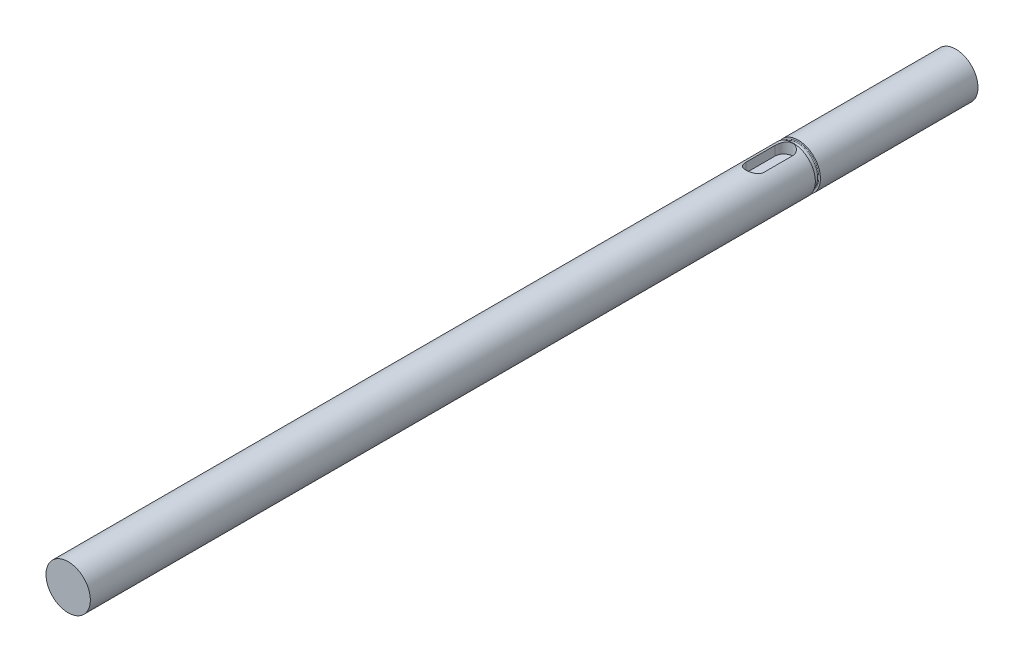
ISO-10303-21;
HEADER;
FILE_DESCRIPTION(('STEP AP214'),'2;1');
FILE_NAME('part.step','',(''),(''),'','','');
FILE_SCHEMA(('AUTOMOTIVE_DESIGN { 1 0 10303 214 1 1 1 1 }'));
ENDSEC;
DATA;
#1=APPLICATION_CONTEXT('core data for automotive mechanical design processes');
#2=APPLICATION_PROTOCOL_DEFINITION('international standard','automotive_design',2000,#1);
#3=PRODUCT_CONTEXT('',#1,'mechanical');
#4=PRODUCT('Part','Part','',(#3));
#5=PRODUCT_RELATED_PRODUCT_CATEGORY('part','',(#4));
#6=PRODUCT_DEFINITION_FORMATION('','',#4);
#7=PRODUCT_DEFINITION_CONTEXT('part definition',#1,'design');
#8=PRODUCT_DEFINITION('design','',#6,#7);
#9=PRODUCT_DEFINITION_SHAPE('','',#8);
#10=(LENGTH_UNIT() NAMED_UNIT(*) SI_UNIT(.MILLI.,.METRE.));
#11=(NAMED_UNIT(*) PLANE_ANGLE_UNIT() SI_UNIT($,.RADIAN.));
#12=(NAMED_UNIT(*) SI_UNIT($,.STERADIAN.) SOLID_ANGLE_UNIT());
#13=UNCERTAINTY_MEASURE_WITH_UNIT(LENGTH_MEASURE(1.E-05),#10,'distance_accuracy_value','');
#14=(GEOMETRIC_REPRESENTATION_CONTEXT(3) GLOBAL_UNCERTAINTY_ASSIGNED_CONTEXT((#13)) GLOBAL_UNIT_ASSIGNED_CONTEXT((#10,
#11,#12)) REPRESENTATION_CONTEXT('',''));
#15=CARTESIAN_POINT('',(0.,0.,0.));
#16=DIRECTION('',(0.,0.,1.));
#17=DIRECTION('',(1.,0.,0.));
#18=AXIS2_PLACEMENT_3D('',#15,#16,#17);
#19=CARTESIAN_POINT('',(0.,0.,-100.));
#20=DIRECTION('',(0.,0.,1.));
#21=DIRECTION('',(-1.,0.,0.));
#22=AXIS2_PLACEMENT_3D('',#19,#20,#21);
#23=CYLINDRICAL_SURFACE('',#22,5.);
#24=CARTESIAN_POINT('',(-1.99999999999998,4.58257569495585,-61.25));
#25=CARTESIAN_POINT('',(-2.00000798036346,4.58256464470382,-61.3038058525026));
#26=CARTESIAN_POINT('',(-1.99782891366023,4.58352306077323,-61.3576056655577));
#27=CARTESIAN_POINT('',(-1.98915905973445,4.58729625417544,-61.4647712982547));
#28=CARTESIAN_POINT('',(-1.98266991468791,4.59011032448546,-61.518137275356));
#29=CARTESIAN_POINT('',(-1.96547603676368,4.5974978292064,-61.6238468215588));
#30=CARTESIAN_POINT('',(-1.95478796820432,4.60206430717534,-61.676193584044));
#31=CARTESIAN_POINT('',(-1.92931630190659,4.61280053296683,-61.7797007717145));
#32=CARTESIAN_POINT('',(-1.91453245417089,4.61897037865399,-61.8308611242772));
#33=CARTESIAN_POINT('',(-1.86426971793521,4.63959291248422,-61.981935850582));
#34=CARTESIAN_POINT('',(-1.82284489460006,4.65617449157431,-62.0796542306897));
#35=CARTESIAN_POINT('',(-1.72548191592175,4.69312370765381,-62.2667955800826));
#36=CARTESIAN_POINT('',(-1.66952996336924,4.71349493864008,-62.3562105529617));
#37=CARTESIAN_POINT('',(-1.54131835736853,4.75700999402115,-62.5292623966742));
#38=CARTESIAN_POINT('',(-1.46836913992728,4.78024245635517,-62.6123672169202));
#39=CARTESIAN_POINT('',(-1.30969646176207,4.82612790548656,-62.7655402722107));
#40=CARTESIAN_POINT('',(-1.2239703849968,4.84878077249721,-62.8356058308657));
#41=CARTESIAN_POINT('',(-1.03800590808967,4.89203417106082,-62.9634063941957));
#42=CARTESIAN_POINT('',(-0.937327933050951,4.91251824543531,-63.0205448092619));
#43=CARTESIAN_POINT('',(-0.7268241432467,4.94803944125004,-63.1168440726887));
#44=CARTESIAN_POINT('',(-0.617002169026234,4.96307883544185,-63.1560124240517));
#45=CARTESIAN_POINT('',(-0.39696744129568,4.98538314653816,-63.2133412013106));
#46=CARTESIAN_POINT('',(-0.287031054523049,4.99298922547927,-63.2324269509057));
#47=CARTESIAN_POINT('',(-0.0652684304565053,5.00080310201085,-63.2520284799456));
#48=CARTESIAN_POINT('',(0.0465571232841751,5.0010135205303,-63.2525508380235));
#49=CARTESIAN_POINT('',(0.262233376226791,4.99421960045302,-63.2355171608401));
#50=CARTESIAN_POINT('',(0.366179202506797,4.98761985585461,-63.218974953326));
#51=CARTESIAN_POINT('',(0.569674786500935,4.96849270441446,-63.1700065729465));
#52=CARTESIAN_POINT('',(0.669224295072849,4.95596496209929,-63.1375795011314));
#53=CARTESIAN_POINT('',(0.862897539070301,4.92596830598785,-63.0573637035755));
#54=CARTESIAN_POINT('',(0.956916851366443,4.90842774755848,-63.0093507591896));
#55=CARTESIAN_POINT('',(1.13580746919776,4.87014602008043,-62.8995354114048));
#56=CARTESIAN_POINT('',(1.22067554984698,4.84940372896448,-62.8377281703094));
#57=CARTESIAN_POINT('',(1.38476339273627,4.80521782746143,-62.6973558197415));
#58=CARTESIAN_POINT('',(1.4632477030894,4.78168627172884,-62.61795752533));
#59=CARTESIAN_POINT('',(1.60609926099478,4.7356195058465,-62.4470199048523));
#60=CARTESIAN_POINT('',(1.67046007709005,4.71308475332783,-62.3554750779057));
#61=CARTESIAN_POINT('',(1.78493657933605,4.67095688856025,-62.1595297159788));
#62=CARTESIAN_POINT('',(1.83458932217622,4.65146702150583,-62.0548351633398));
#63=CARTESIAN_POINT('',(1.91521298357264,4.61886105059582,-61.8376384755705));
#64=CARTESIAN_POINT('',(1.94621696002208,4.60573367628738,-61.7251505526617));
#65=CARTESIAN_POINT('',(1.9781058182572,4.59208303529493,-61.551256365842));
#66=CARTESIAN_POINT('',(1.98630505165979,4.58853437680526,-61.4913424506987));
#67=CARTESIAN_POINT('',(1.99725282103812,4.58377540314389,-61.3709649810045));
#68=CARTESIAN_POINT('',(2.00000471568568,4.58256364711745,-61.3105017882422));
#69=CARTESIAN_POINT('',(2.,4.58257569495584,-61.25));
#70=B_SPLINE_CURVE_WITH_KNOTS('',3,(#24,#25,#26,#27,#28,#29,#30,#31,#32,#33,#34,#35,#36,#37,#38,
#39,#40,#41,#42,#43,#44,#45,#46,#47,#48,#49,#50,#51,#52,#53,#54,#55,#56,#57,#58,#59,#60,#61,#62,
#63,#64,#65,#66,#67,#68,#69),.UNSPECIFIED.,.F.,.F.,(4,2,2,2,2,2,2,2,2,2,2,2,2,2,2,2,2,2,2,2,2,2,
4),(0.,0.161354853098824,0.322648263883208,0.483307911251883,0.643977367092303,
0.964683001739086,1.28569434942625,1.62318047995497,1.96073580539189,2.31162858925762,
2.66237473197321,2.99613876504268,3.32978451514654,3.64468915259533,3.95961161305652,
4.27928176927544,4.59906421133017,4.9398187467515,5.28072813203931,5.63144241548458,
5.98153315592122,6.1630019255781,6.34435877193558),.UNSPECIFIED.);
#71=CARTESIAN_POINT('',(-1.99999999999998,4.58257569495585,-61.25));
#72=VERTEX_POINT('',#71);
#73=CARTESIAN_POINT('',(2.,4.58257569495584,-61.25));
#74=VERTEX_POINT('',#73);
#75=EDGE_CURVE('E116',#72,#74,#70,.T.);
#76=ORIENTED_EDGE('',*,*,#75,.T.);
#77=DIRECTION('',(0.,0.,1.));
#78=VECTOR('',#77,1.);
#79=CARTESIAN_POINT('',(1.99999999999998,4.58257569495585,-100.));
#80=LINE('',#79,#78);
#81=CARTESIAN_POINT('',(1.99999999999999,4.58257569495585,-54.75));
#82=VERTEX_POINT('',#81);
#83=EDGE_CURVE('E47',#74,#82,#80,.T.);
#84=ORIENTED_EDGE('',*,*,#83,.T.);
#85=CARTESIAN_POINT('',(2.,4.58257569495584,-54.75));
#86=CARTESIAN_POINT('',(2.00000798036348,4.58256464470381,-54.6961941474974));
#87=CARTESIAN_POINT('',(1.99782891366025,4.58352306077323,-54.6423943344424));
#88=CARTESIAN_POINT('',(1.98915905973447,4.58729625417543,-54.5352287017453));
#89=CARTESIAN_POINT('',(1.98266991468793,4.59011032448545,-54.481862724644));
#90=CARTESIAN_POINT('',(1.9654760367637,4.59749782920639,-54.3761531784412));
#91=CARTESIAN_POINT('',(1.95478796820434,4.60206430717533,-54.323806415956));
#92=CARTESIAN_POINT('',(1.92931630190661,4.61280053296682,-54.2202992282855));
#93=CARTESIAN_POINT('',(1.91453245417091,4.61897037865398,-54.1691388757228));
#94=CARTESIAN_POINT('',(1.86426971793523,4.63959291248421,-54.018064149418));
#95=CARTESIAN_POINT('',(1.82284489460008,4.6561744915743,-53.9203457693103));
#96=CARTESIAN_POINT('',(1.72548191592177,4.6931237076538,-53.7332044199174));
#97=CARTESIAN_POINT('',(1.66952996336926,4.71349493864007,-53.6437894470384));
#98=CARTESIAN_POINT('',(1.54131835736855,4.75700999402114,-53.4707376033258));
#99=CARTESIAN_POINT('',(1.46836913992731,4.78024245635516,-53.3876327830798));
#100=CARTESIAN_POINT('',(1.30969646176209,4.82612790548656,-53.2344597277893));
#101=CARTESIAN_POINT('',(1.22397038499682,4.84878077249721,-53.1643941691343));
#102=CARTESIAN_POINT('',(1.03800590808969,4.89203417106082,-53.0365936058044));
#103=CARTESIAN_POINT('',(0.937327933050968,4.91251824543531,-52.9794551907381));
#104=CARTESIAN_POINT('',(0.726824143246719,4.94803944125003,-52.8831559273114));
#105=CARTESIAN_POINT('',(0.617002169026255,4.96307883544185,-52.8439875759483));
#106=CARTESIAN_POINT('',(0.396967441295703,4.98538314653816,-52.7866587986894));
#107=CARTESIAN_POINT('',(0.287031054523071,4.99298922547927,-52.7675730490944));
#108=CARTESIAN_POINT('',(0.0652684304565268,5.00080310201086,-52.7479715200544));
#109=CARTESIAN_POINT('',(-0.046557123284154,5.0010135205303,-52.7474491619765));
#110=CARTESIAN_POINT('',(-0.262233376226772,4.99421960045302,-52.7644828391599));
#111=CARTESIAN_POINT('',(-0.366179202506779,4.98761985585461,-52.781025046674));
#112=CARTESIAN_POINT('',(-0.569674786500916,4.96849270441446,-52.8299934270536));
#113=CARTESIAN_POINT('',(-0.669224295072828,4.95596496209929,-52.8624204988686));
#114=CARTESIAN_POINT('',(-0.86289753907028,4.92596830598785,-52.9426362964245));
#115=CARTESIAN_POINT('',(-0.956916851366425,4.90842774755848,-52.9906492408105));
#116=CARTESIAN_POINT('',(-1.13580746919775,4.87014602008043,-53.1004645885952));
#117=CARTESIAN_POINT('',(-1.22067554984696,4.84940372896449,-53.1622718296906));
#118=CARTESIAN_POINT('',(-1.38476339273625,4.80521782746144,-53.3026441802585));
#119=CARTESIAN_POINT('',(-1.46324770308938,4.78168627172885,-53.38204247467));
#120=CARTESIAN_POINT('',(-1.60609926099476,4.73561950584651,-53.5529800951477));
#121=CARTESIAN_POINT('',(-1.67046007709003,4.71308475332784,-53.6445249220943));
#122=CARTESIAN_POINT('',(-1.78493657933603,4.67095688856025,-53.8404702840212));
#123=CARTESIAN_POINT('',(-1.8345893221762,4.65146702150584,-53.9451648366602));
#124=CARTESIAN_POINT('',(-1.91521298357262,4.61886105059582,-54.1623615244295));
#125=CARTESIAN_POINT('',(-1.94621696002206,4.60573367628739,-54.2748494473383));
#126=CARTESIAN_POINT('',(-1.97810581825718,4.59208303529494,-54.448743634158));
#127=CARTESIAN_POINT('',(-1.98630505165977,4.58853437680527,-54.5086575493013));
#128=CARTESIAN_POINT('',(-1.99725282103809,4.5837754031439,-54.6290350189955));
#129=CARTESIAN_POINT('',(-2.00000471568566,4.58256364711745,-54.6894982117578));
#130=CARTESIAN_POINT('',(-1.99999999999998,4.58257569495585,-54.75));
#131=B_SPLINE_CURVE_WITH_KNOTS('',3,(#85,#86,#87,#88,#89,#90,#91,#92,#93,#94,#95,#96,#97,#98,
#99,#100,#101,#102,#103,#104,#105,#106,#107,#108,#109,#110,#111,#112,#113,#114,#115,#116,#117,
#118,#119,#120,#121,#122,#123,#124,#125,#126,#127,#128,#129,#130),.UNSPECIFIED.,.F.,.F.,(4,2,2,
2,2,2,2,2,2,2,2,2,2,2,2,2,2,2,2,2,2,2,4),(0.,0.161354853098824,0.322648263883208,
0.483307911251883,0.643977367092303,0.964683001739087,1.28569434942625,1.62318047995497,
1.9607358053919,2.31162858925762,2.66237473197321,2.99613876504268,3.32978451514654,
3.64468915259533,3.95961161305652,4.27928176927545,4.59906421133017,4.9398187467515,
5.2807281320393,5.63144241548458,5.98153315592122,6.1630019255781,6.34435877193558),.UNSPECIFIED.);
#132=CARTESIAN_POINT('',(-1.99999999999999,4.58257569495584,-54.75));
#133=VERTEX_POINT('',#132);
#134=EDGE_CURVE('E125',#82,#133,#131,.T.);
#135=ORIENTED_EDGE('',*,*,#134,.T.);
#136=DIRECTION('',(0.,0.,1.));
#137=VECTOR('',#136,1.);
#138=CARTESIAN_POINT('',(-2.,4.58257569495584,-100.));
#139=LINE('',#138,#137);
#140=EDGE_CURVE('E11',#133,#72,#139,.F.);
#141=ORIENTED_EDGE('',*,*,#140,.T.);
#142=EDGE_LOOP('',(#76,#84,#135,#141));
#143=FACE_BOUND('',#142,.T.);
#144=CARTESIAN_POINT('',(0.,0.,100.));
#145=DIRECTION('',(0.,0.,1.));
#146=DIRECTION('',(1.,0.,0.));
#147=AXIS2_PLACEMENT_3D('',#144,#145,#146);
#148=CIRCLE('',#147,5.);
#149=CARTESIAN_POINT('',(5.,0.,100.));
#150=VERTEX_POINT('',#149);
#151=EDGE_CURVE('E95',#150,#150,#148,.T.);
#152=ORIENTED_EDGE('',*,*,#151,.F.);
#153=EDGE_LOOP('',(#152));
#154=FACE_BOUND('',#153,.T.);
#155=CARTESIAN_POINT('',(0.,0.,-63.35));
#156=DIRECTION('',(0.,0.,1.));
#157=DIRECTION('',(0.,-1.,0.));
#158=AXIS2_PLACEMENT_3D('',#155,#156,#157);
#159=CIRCLE('',#158,5.);
#160=CARTESIAN_POINT('',(0.,-5.,-63.35));
#161=VERTEX_POINT('',#160);
#162=EDGE_CURVE('E102',#161,#161,#159,.T.);
#163=ORIENTED_EDGE('',*,*,#162,.T.);
#164=EDGE_LOOP('',(#163));
#165=FACE_BOUND('',#164,.T.);
#166=ADVANCED_FACE('F37',(#143,#154,#165),#23,.T.);
#167=CARTESIAN_POINT('',(0.,0.,100.));
#168=DIRECTION('',(0.,0.,-1.));
#169=DIRECTION('',(1.,0.,0.));
#170=AXIS2_PLACEMENT_3D('',#167,#168,#169);
#171=PLANE('',#170);
#172=ORIENTED_EDGE('',*,*,#151,.T.);
#173=EDGE_LOOP('',(#172));
#174=FACE_BOUND('',#173,.T.);
#175=ADVANCED_FACE('F142',(#174),#171,.F.);
#176=CARTESIAN_POINT('',(0.,5.,-54.75));
#177=DIRECTION('',(0.,-1.,0.));
#178=DIRECTION('',(0.,0.,1.));
#179=AXIS2_PLACEMENT_3D('',#176,#177,#178);
#180=CYLINDRICAL_SURFACE('',#179,1.99999999999999);
#181=DIRECTION('',(0.,-1.,0.));
#182=VECTOR('',#181,1.);
#183=CARTESIAN_POINT('',(1.99999999999999,5.,-54.75));
#184=LINE('',#183,#182);
#185=CARTESIAN_POINT('',(1.99999999999999,2.5,-54.75));
#186=VERTEX_POINT('',#185);
#187=EDGE_CURVE('E99',#82,#186,#184,.T.);
#188=ORIENTED_EDGE('',*,*,#187,.T.);
#189=CARTESIAN_POINT('',(0.,2.5,-54.75));
#190=DIRECTION('',(0.,-1.,0.));
#191=DIRECTION('',(0.,0.,-1.));
#192=AXIS2_PLACEMENT_3D('',#189,#190,#191);
#193=CIRCLE('',#192,1.99999999999999);
#194=CARTESIAN_POINT('',(-1.99999999999999,2.5,-54.75));
#195=VERTEX_POINT('',#194);
#196=EDGE_CURVE('E87',#186,#195,#193,.T.);
#197=ORIENTED_EDGE('',*,*,#196,.T.);
#198=DIRECTION('',(0.,-1.,0.));
#199=VECTOR('',#198,1.);
#200=CARTESIAN_POINT('',(-1.99999999999999,5.,-54.75));
#201=LINE('',#200,#199);
#202=EDGE_CURVE('E63',#133,#195,#201,.T.);
#203=ORIENTED_EDGE('',*,*,#202,.F.);
#204=ORIENTED_EDGE('',*,*,#134,.F.);
#205=EDGE_LOOP('',(#188,#197,#203,#204));
#206=FACE_BOUND('',#205,.T.);
#207=ADVANCED_FACE('F98',(#206),#180,.F.);
#208=CARTESIAN_POINT('',(-1.99999999999999,5.,-54.75));
#209=DIRECTION('',(1.,0.,0.));
#210=DIRECTION('',(0.,0.,1.));
#211=AXIS2_PLACEMENT_3D('',#208,#209,#210);
#212=PLANE('',#211);
#213=ORIENTED_EDGE('',*,*,#140,.F.);
#214=ORIENTED_EDGE('',*,*,#202,.T.);
#215=DIRECTION('',(0.,0.,-1.));
#216=VECTOR('',#215,1.);
#217=CARTESIAN_POINT('',(-1.99999999999999,2.5,-54.75));
#218=LINE('',#217,#216);
#219=CARTESIAN_POINT('',(-1.99999999999998,2.5,-61.25));
#220=VERTEX_POINT('',#219);
#221=EDGE_CURVE('E85',#195,#220,#218,.T.);
#222=ORIENTED_EDGE('',*,*,#221,.T.);
#223=DIRECTION('',(0.,-1.,0.));
#224=VECTOR('',#223,1.);
#225=CARTESIAN_POINT('',(-1.99999999999998,5.,-61.25));
#226=LINE('',#225,#224);
#227=EDGE_CURVE('E96',#72,#220,#226,.T.);
#228=ORIENTED_EDGE('',*,*,#227,.F.);
#229=EDGE_LOOP('',(#213,#214,#222,#228));
#230=FACE_BOUND('',#229,.T.);
#231=ADVANCED_FACE('F93',(#230),#212,.T.);
#232=CARTESIAN_POINT('',(0.,5.,-61.25));
#233=DIRECTION('',(0.,-1.,0.));
#234=DIRECTION('',(0.,0.,1.));
#235=AXIS2_PLACEMENT_3D('',#232,#233,#234);
#236=CYLINDRICAL_SURFACE('',#235,1.99999999999999);
#237=ORIENTED_EDGE('',*,*,#227,.T.);
#238=CARTESIAN_POINT('',(0.,2.5,-61.25));
#239=DIRECTION('',(0.,-1.,0.));
#240=DIRECTION('',(0.,0.,-1.));
#241=AXIS2_PLACEMENT_3D('',#238,#239,#240);
#242=CIRCLE('',#241,1.99999999999999);
#243=CARTESIAN_POINT('',(1.99999999999999,2.5,-61.25));
#244=VERTEX_POINT('',#243);
#245=EDGE_CURVE('E89',#220,#244,#242,.T.);
#246=ORIENTED_EDGE('',*,*,#245,.T.);
#247=DIRECTION('',(0.,-1.,0.));
#248=VECTOR('',#247,1.);
#249=CARTESIAN_POINT('',(1.99999999999999,5.,-61.25));
#250=LINE('',#249,#248);
#251=EDGE_CURVE('E55',#74,#244,#250,.T.);
#252=ORIENTED_EDGE('',*,*,#251,.F.);
#253=ORIENTED_EDGE('',*,*,#75,.F.);
#254=EDGE_LOOP('',(#237,#246,#252,#253));
#255=FACE_BOUND('',#254,.T.);
#256=ADVANCED_FACE('F131',(#255),#236,.F.);
#257=CARTESIAN_POINT('',(1.99999999999999,5.,-54.75));
#258=DIRECTION('',(-1.,0.,0.));
#259=DIRECTION('',(0.,0.,-1.));
#260=AXIS2_PLACEMENT_3D('',#257,#258,#259);
#261=PLANE('',#260);
#262=ORIENTED_EDGE('',*,*,#83,.F.);
#263=ORIENTED_EDGE('',*,*,#251,.T.);
#264=DIRECTION('',(0.,0.,1.));
#265=VECTOR('',#264,1.);
#266=CARTESIAN_POINT('',(1.99999999999999,2.5,-54.75));
#267=LINE('',#266,#265);
#268=EDGE_CURVE('E108',#244,#186,#267,.T.);
#269=ORIENTED_EDGE('',*,*,#268,.T.);
#270=ORIENTED_EDGE('',*,*,#187,.F.);
#271=EDGE_LOOP('',(#262,#263,#269,#270));
#272=FACE_BOUND('',#271,.T.);
#273=ADVANCED_FACE('F136',(#272),#261,.T.);
#274=CARTESIAN_POINT('',(0.,2.5,-54.75));
#275=DIRECTION('',(0.,1.,0.));
#276=DIRECTION('',(0.,0.,-1.));
#277=AXIS2_PLACEMENT_3D('',#274,#275,#276);
#278=PLANE('',#277);
#279=ORIENTED_EDGE('',*,*,#196,.F.);
#280=ORIENTED_EDGE('',*,*,#268,.F.);
#281=ORIENTED_EDGE('',*,*,#245,.F.);
#282=ORIENTED_EDGE('',*,*,#221,.F.);
#283=EDGE_LOOP('',(#279,#280,#281,#282));
#284=FACE_BOUND('',#283,.T.);
#285=ADVANCED_FACE('F86',(#284),#278,.T.);
#286=CARTESIAN_POINT('',(0.,4.64999999999998,-64.5));
#287=DIRECTION('',(0.,0.,1.));
#288=DIRECTION('',(0.,1.,0.));
#289=AXIS2_PLACEMENT_3D('',#286,#287,#288);
#290=PLANE('',#289);
#291=CARTESIAN_POINT('',(0.,0.,-64.5));
#292=DIRECTION('',(0.,0.,-1.));
#293=DIRECTION('',(0.,1.,0.));
#294=AXIS2_PLACEMENT_3D('',#291,#292,#293);
#295=CIRCLE('',#294,4.65000000000001);
#296=CARTESIAN_POINT('',(0.,4.64999999999998,-64.5));
#297=VERTEX_POINT('',#296);
#298=EDGE_CURVE('E104',#297,#297,#295,.T.);
#299=ORIENTED_EDGE('',*,*,#298,.T.);
#300=EDGE_LOOP('',(#299));
#301=FACE_BOUND('',#300,.T.);
#302=CARTESIAN_POINT('',(0.,0.,-64.5));
#303=DIRECTION('',(0.,0.,-1.));
#304=DIRECTION('',(0.,1.,0.));
#305=AXIS2_PLACEMENT_3D('',#302,#303,#304);
#306=CIRCLE('',#305,5.);
#307=CARTESIAN_POINT('',(0.,5.,-64.5));
#308=VERTEX_POINT('',#307);
#309=EDGE_CURVE('E42',#308,#308,#306,.T.);
#310=ORIENTED_EDGE('',*,*,#309,.F.);
#311=EDGE_LOOP('',(#310));
#312=FACE_BOUND('',#311,.T.);
#313=ADVANCED_FACE('F167',(#301,#312),#290,.T.);
#314=CARTESIAN_POINT('',(0.,6.6414274466808,-63.35));
#315=DIRECTION('',(0.,0.,-1.));
#316=DIRECTION('',(0.,-1.,0.));
#317=AXIS2_PLACEMENT_3D('',#314,#315,#316);
#318=PLANE('',#317);
#319=CARTESIAN_POINT('',(0.,0.,-63.35));
#320=DIRECTION('',(0.,0.,-1.));
#321=DIRECTION('',(0.,1.,0.));
#322=AXIS2_PLACEMENT_3D('',#319,#320,#321);
#323=CIRCLE('',#322,4.65000000000001);
#324=CARTESIAN_POINT('',(0.,4.64999999999998,-63.35));
#325=VERTEX_POINT('',#324);
#326=EDGE_CURVE('E192',#325,#325,#323,.T.);
#327=ORIENTED_EDGE('',*,*,#326,.F.);
#328=EDGE_LOOP('',(#327));
#329=FACE_BOUND('',#328,.T.);
#330=ORIENTED_EDGE('',*,*,#162,.F.);
#331=EDGE_LOOP('',(#330));
#332=FACE_BOUND('',#331,.T.);
#333=ADVANCED_FACE('F171',(#329,#332),#318,.T.);
#334=CARTESIAN_POINT('',(0.,0.,-64.35));
#335=DIRECTION('',(0.,0.,1.));
#336=DIRECTION('',(0.,1.,0.));
#337=AXIS2_PLACEMENT_3D('',#334,#335,#336);
#338=TOROIDAL_SURFACE('',#337,4.65000000000001,0.149999999999998);
#339=ORIENTED_EDGE('',*,*,#298,.F.);
#340=EDGE_LOOP('',(#339));
#341=FACE_BOUND('',#340,.T.);
#342=CARTESIAN_POINT('',(0.,0.,-64.35));
#343=DIRECTION('',(0.,0.,-1.));
#344=DIRECTION('',(0.,1.,0.));
#345=AXIS2_PLACEMENT_3D('',#342,#343,#344);
#346=CIRCLE('',#345,4.50000000000002);
#347=CARTESIAN_POINT('',(0.,4.49999999999998,-64.35));
#348=VERTEX_POINT('',#347);
#349=EDGE_CURVE('E160',#348,#348,#346,.T.);
#350=ORIENTED_EDGE('',*,*,#349,.T.);
#351=EDGE_LOOP('',(#350));
#352=FACE_BOUND('',#351,.T.);
#353=ADVANCED_FACE('F175',(#341,#352),#338,.F.);
#354=CARTESIAN_POINT('',(0.,0.,-150.));
#355=DIRECTION('',(0.,0.,1.));
#356=DIRECTION('',(0.,1.,0.));
#357=AXIS2_PLACEMENT_3D('',#354,#355,#356);
#358=CYLINDRICAL_SURFACE('',#357,4.50000000000002);
#359=ORIENTED_EDGE('',*,*,#349,.F.);
#360=EDGE_LOOP('',(#359));
#361=FACE_BOUND('',#360,.T.);
#362=CARTESIAN_POINT('',(0.,0.,-63.5));
#363=DIRECTION('',(0.,0.,-1.));
#364=DIRECTION('',(0.,1.,0.));
#365=AXIS2_PLACEMENT_3D('',#362,#363,#364);
#366=CIRCLE('',#365,4.50000000000002);
#367=CARTESIAN_POINT('',(0.,4.49999999999998,-63.5));
#368=VERTEX_POINT('',#367);
#369=EDGE_CURVE('E194',#368,#368,#366,.T.);
#370=ORIENTED_EDGE('',*,*,#369,.T.);
#371=EDGE_LOOP('',(#370));
#372=FACE_BOUND('',#371,.T.);
#373=ADVANCED_FACE('F178',(#361,#372),#358,.T.);
#374=CARTESIAN_POINT('',(0.,0.,-63.5));
#375=DIRECTION('',(0.,0.,1.));
#376=DIRECTION('',(0.,1.,0.));
#377=AXIS2_PLACEMENT_3D('',#374,#375,#376);
#378=TOROIDAL_SURFACE('',#377,4.65000000000001,0.149999999999998);
#379=ORIENTED_EDGE('',*,*,#369,.F.);
#380=EDGE_LOOP('',(#379));
#381=FACE_BOUND('',#380,.T.);
#382=ORIENTED_EDGE('',*,*,#326,.T.);
#383=EDGE_LOOP('',(#382));
#384=FACE_BOUND('',#383,.T.);
#385=ADVANCED_FACE('F145',(#381,#384),#378,.F.);
#386=CARTESIAN_POINT('',(0.,0.,-100.));
#387=DIRECTION('',(0.,0.,-1.));
#388=DIRECTION('',(1.,0.,0.));
#389=AXIS2_PLACEMENT_3D('',#386,#387,#388);
#390=PLANE('',#389);
#391=CARTESIAN_POINT('',(0.,0.,-100.));
#392=DIRECTION('',(0.,0.,1.));
#393=DIRECTION('',(1.,0.,0.));
#394=AXIS2_PLACEMENT_3D('',#391,#392,#393);
#395=CIRCLE('',#394,5.);
#396=CARTESIAN_POINT('',(5.,0.,-100.));
#397=VERTEX_POINT('',#396);
#398=EDGE_CURVE('E113',#397,#397,#395,.T.);
#399=ORIENTED_EDGE('',*,*,#398,.F.);
#400=EDGE_LOOP('',(#399));
#401=FACE_BOUND('',#400,.T.);
#402=ADVANCED_FACE('F143',(#401),#390,.T.);
#403=ORIENTED_EDGE('',*,*,#398,.T.);
#404=EDGE_LOOP('',(#403));
#405=FACE_BOUND('',#404,.T.);
#406=ORIENTED_EDGE('',*,*,#309,.T.);
#407=EDGE_LOOP('',(#406));
#408=FACE_BOUND('',#407,.T.);
#409=ADVANCED_FACE('F39',(#405,#408),#23,.T.);
#410=CLOSED_SHELL('',(#166,#175,#207,#231,#256,#273,#285,#313,#333,#353,#373,#385,#402,#409));
#411=MANIFOLD_SOLID_BREP('B2',#410);
#412=ADVANCED_BREP_SHAPE_REPRESENTATION('',(#18,#411),#14);
#413=SHAPE_DEFINITION_REPRESENTATION(#9,#412);
ENDSEC;
END-ISO-10303-21;
